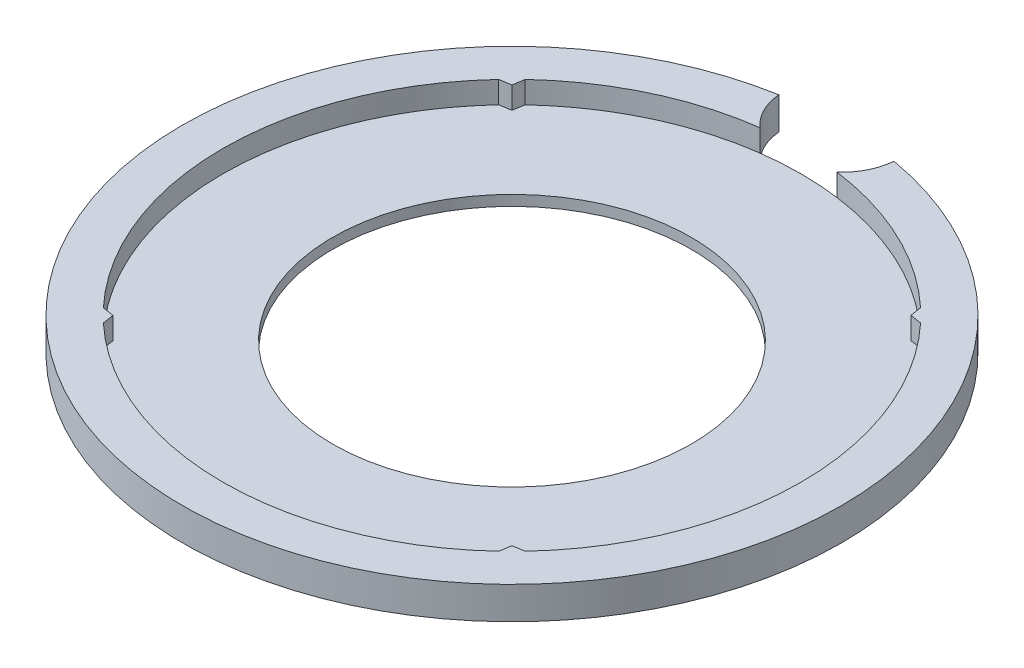
ISO-10303-21;
HEADER;
FILE_DESCRIPTION(('STEP AP214'),'2;1');
FILE_NAME('part.step','',(''),(''),'','','');
FILE_SCHEMA(('AUTOMOTIVE_DESIGN { 1 0 10303 214 1 1 1 1 }'));
ENDSEC;
DATA;
#1=APPLICATION_CONTEXT('core data for automotive mechanical design processes');
#2=APPLICATION_PROTOCOL_DEFINITION('international standard','automotive_design',2000,#1);
#3=PRODUCT_CONTEXT('',#1,'mechanical');
#4=PRODUCT('Part','Part','',(#3));
#5=PRODUCT_RELATED_PRODUCT_CATEGORY('part','',(#4));
#6=PRODUCT_DEFINITION_FORMATION('','',#4);
#7=PRODUCT_DEFINITION_CONTEXT('part definition',#1,'design');
#8=PRODUCT_DEFINITION('design','',#6,#7);
#9=PRODUCT_DEFINITION_SHAPE('','',#8);
#10=(LENGTH_UNIT() NAMED_UNIT(*) SI_UNIT(.MILLI.,.METRE.));
#11=(NAMED_UNIT(*) PLANE_ANGLE_UNIT() SI_UNIT($,.RADIAN.));
#12=(NAMED_UNIT(*) SI_UNIT($,.STERADIAN.) SOLID_ANGLE_UNIT());
#13=UNCERTAINTY_MEASURE_WITH_UNIT(LENGTH_MEASURE(1.E-05),#10,'distance_accuracy_value','');
#14=(GEOMETRIC_REPRESENTATION_CONTEXT(3) GLOBAL_UNCERTAINTY_ASSIGNED_CONTEXT((#13)) GLOBAL_UNIT_ASSIGNED_CONTEXT((#10,
#11,#12)) REPRESENTATION_CONTEXT('',''));
#15=CARTESIAN_POINT('',(0.,0.,0.));
#16=DIRECTION('',(0.,0.,1.));
#17=DIRECTION('',(1.,0.,0.));
#18=AXIS2_PLACEMENT_3D('',#15,#16,#17);
#19=CARTESIAN_POINT('',(0.,2.8,0.));
#20=DIRECTION('',(0.,-1.,0.));
#21=DIRECTION('',(0.,0.,-1.));
#22=AXIS2_PLACEMENT_3D('',#19,#20,#21);
#23=CYLINDRICAL_SURFACE('',#22,25.);
#24=DIRECTION('',(0.,1.,0.));
#25=VECTOR('',#24,1.);
#26=CARTESIAN_POINT('',(-18.2409192326324,-1.61934024607922,-17.0958727635818));
#27=LINE('',#26,#25);
#28=CARTESIAN_POINT('',(-18.2409192326324,0.,-17.0958727635818));
#29=VERTEX_POINT('',#28);
#30=CARTESIAN_POINT('',(-18.2409192326324,2.8,-17.0958727635818));
#31=VERTEX_POINT('',#30);
#32=EDGE_CURVE('E176',#29,#31,#27,.T.);
#33=ORIENTED_EDGE('',*,*,#32,.T.);
#34=CARTESIAN_POINT('',(0.,2.8,0.));
#35=DIRECTION('',(0.,-1.,0.));
#36=DIRECTION('',(0.,0.,-1.));
#37=AXIS2_PLACEMENT_3D('',#34,#35,#36);
#38=CIRCLE('',#37,25.);
#39=CARTESIAN_POINT('',(-18.2409192326327,2.8,17.0958727635816));
#40=VERTEX_POINT('',#39);
#41=EDGE_CURVE('E281',#40,#31,#38,.T.);
#42=ORIENTED_EDGE('',*,*,#41,.F.);
#43=DIRECTION('',(0.,1.,0.));
#44=VECTOR('',#43,1.);
#45=CARTESIAN_POINT('',(-18.2409192326327,-1.61934024607922,17.0958727635816));
#46=LINE('',#45,#44);
#47=CARTESIAN_POINT('',(-18.2409192326327,0.,17.0958727635816));
#48=VERTEX_POINT('',#47);
#49=EDGE_CURVE('E69',#48,#40,#46,.T.);
#50=ORIENTED_EDGE('',*,*,#49,.F.);
#51=CARTESIAN_POINT('',(0.,0.,0.));
#52=DIRECTION('',(0.,-1.,0.));
#53=DIRECTION('',(0.,0.,-1.));
#54=AXIS2_PLACEMENT_3D('',#51,#52,#53);
#55=CIRCLE('',#54,25.);
#56=EDGE_CURVE('E305',#48,#29,#55,.T.);
#57=ORIENTED_EDGE('',*,*,#56,.T.);
#58=EDGE_LOOP('',(#33,#42,#50,#57));
#59=FACE_BOUND('',#58,.T.);
#60=ADVANCED_FACE('F46',(#59),#23,.F.);
#61=DIRECTION('',(0.,1.,0.));
#62=VECTOR('',#61,1.);
#63=CARTESIAN_POINT('',(-17.0958727635818,-1.61934024607922,18.2409192326325));
#64=LINE('',#63,#62);
#65=CARTESIAN_POINT('',(-17.0958727635818,0.,18.2409192326325));
#66=VERTEX_POINT('',#65);
#67=CARTESIAN_POINT('',(-17.0958727635818,2.8,18.2409192326325));
#68=VERTEX_POINT('',#67);
#69=EDGE_CURVE('E190',#66,#68,#64,.T.);
#70=ORIENTED_EDGE('',*,*,#69,.T.);
#71=CARTESIAN_POINT('',(17.0958727635817,2.8,18.2409192326326));
#72=VERTEX_POINT('',#71);
#73=EDGE_CURVE('E283',#72,#68,#38,.T.);
#74=ORIENTED_EDGE('',*,*,#73,.F.);
#75=DIRECTION('',(0.,1.,0.));
#76=VECTOR('',#75,1.);
#77=CARTESIAN_POINT('',(17.0958727635817,-1.61934024607922,18.2409192326326));
#78=LINE('',#77,#76);
#79=CARTESIAN_POINT('',(17.0958727635817,0.,18.2409192326326));
#80=VERTEX_POINT('',#79);
#81=EDGE_CURVE('E206',#80,#72,#78,.T.);
#82=ORIENTED_EDGE('',*,*,#81,.F.);
#83=EDGE_CURVE('E302',#80,#66,#55,.T.);
#84=ORIENTED_EDGE('',*,*,#83,.T.);
#85=EDGE_LOOP('',(#70,#74,#82,#84));
#86=FACE_BOUND('',#85,.T.);
#87=ADVANCED_FACE('F301',(#86),#23,.F.);
#88=DIRECTION('',(0.,1.,0.));
#89=VECTOR('',#88,1.);
#90=CARTESIAN_POINT('',(18.2409192326326,-1.61934024607922,17.0958727635817));
#91=LINE('',#90,#89);
#92=CARTESIAN_POINT('',(18.2409192326326,0.,17.0958727635817));
#93=VERTEX_POINT('',#92);
#94=CARTESIAN_POINT('',(18.2409192326326,2.8,17.0958727635817));
#95=VERTEX_POINT('',#94);
#96=EDGE_CURVE('E205',#93,#95,#91,.T.);
#97=ORIENTED_EDGE('',*,*,#96,.T.);
#98=CARTESIAN_POINT('',(18.2409192326328,2.8,-17.0958727635815));
#99=VERTEX_POINT('',#98);
#100=EDGE_CURVE('E255',#99,#95,#38,.T.);
#101=ORIENTED_EDGE('',*,*,#100,.F.);
#102=DIRECTION('',(0.,1.,0.));
#103=VECTOR('',#102,1.);
#104=CARTESIAN_POINT('',(18.2409192326328,-1.61934024607922,-17.0958727635815));
#105=LINE('',#104,#103);
#106=CARTESIAN_POINT('',(18.2409192326328,0.,-17.0958727635815));
#107=VERTEX_POINT('',#106);
#108=EDGE_CURVE('E233',#107,#99,#105,.T.);
#109=ORIENTED_EDGE('',*,*,#108,.F.);
#110=EDGE_CURVE('E259',#107,#93,#55,.T.);
#111=ORIENTED_EDGE('',*,*,#110,.T.);
#112=EDGE_LOOP('',(#97,#101,#109,#111));
#113=FACE_BOUND('',#112,.T.);
#114=ADVANCED_FACE('F326',(#113),#23,.F.);
#115=DIRECTION('',(0.,1.,0.));
#116=VECTOR('',#115,1.);
#117=CARTESIAN_POINT('',(17.0958727635819,-1.61934024607922,-18.2409192326324));
#118=LINE('',#117,#116);
#119=CARTESIAN_POINT('',(17.0958727635819,0.,-18.2409192326324));
#120=VERTEX_POINT('',#119);
#121=CARTESIAN_POINT('',(17.0958727635819,2.8,-18.2409192326324));
#122=VERTEX_POINT('',#121);
#123=EDGE_CURVE('E236',#120,#122,#118,.T.);
#124=ORIENTED_EDGE('',*,*,#123,.T.);
#125=CARTESIAN_POINT('',(3.33679125812165,2.8,-24.7763157894737));
#126=VERTEX_POINT('',#125);
#127=EDGE_CURVE('E251',#126,#122,#38,.T.);
#128=ORIENTED_EDGE('',*,*,#127,.F.);
#129=DIRECTION('',(0.,1.,0.));
#130=VECTOR('',#129,1.);
#131=CARTESIAN_POINT('',(3.33679125812165,1.400006,-24.7763157894737));
#132=LINE('',#131,#130);
#133=CARTESIAN_POINT('',(3.33679125812164,0.,-24.7763157894737));
#134=VERTEX_POINT('',#133);
#135=EDGE_CURVE('E12',#126,#134,#132,.F.);
#136=ORIENTED_EDGE('',*,*,#135,.T.);
#137=EDGE_CURVE('E257',#134,#120,#55,.T.);
#138=ORIENTED_EDGE('',*,*,#137,.T.);
#139=EDGE_LOOP('',(#124,#128,#136,#138));
#140=FACE_BOUND('',#139,.T.);
#141=ADVANCED_FACE('F330',(#140),#23,.F.);
#142=CARTESIAN_POINT('',(0.,2.8,0.));
#143=DIRECTION('',(0.,-1.,0.));
#144=DIRECTION('',(0.,0.,-1.));
#145=AXIS2_PLACEMENT_3D('',#142,#143,#144);
#146=CYLINDRICAL_SURFACE('',#145,28.5);
#147=DIRECTION('',(0.,1.,0.));
#148=VECTOR('',#147,1.);
#149=CARTESIAN_POINT('',(4.98072616371172,1.400006,-28.0614035087719));
#150=LINE('',#149,#148);
#151=CARTESIAN_POINT('',(4.9807261637117,2.8,-28.0614035087719));
#152=VERTEX_POINT('',#151);
#153=CARTESIAN_POINT('',(4.98072616371172,0.,-28.0614035087719));
#154=VERTEX_POINT('',#153);
#155=EDGE_CURVE('E249',#152,#154,#150,.F.);
#156=ORIENTED_EDGE('',*,*,#155,.F.);
#157=CARTESIAN_POINT('',(0.,2.8,0.));
#158=DIRECTION('',(0.,-1.,0.));
#159=DIRECTION('',(0.,0.,-1.));
#160=AXIS2_PLACEMENT_3D('',#157,#158,#159);
#161=CIRCLE('',#160,28.5);
#162=CARTESIAN_POINT('',(-4.9807261637117,2.8,-28.0614035087719));
#163=VERTEX_POINT('',#162);
#164=EDGE_CURVE('E260',#152,#163,#161,.T.);
#165=ORIENTED_EDGE('',*,*,#164,.T.);
#166=DIRECTION('',(0.,1.,0.));
#167=VECTOR('',#166,1.);
#168=CARTESIAN_POINT('',(-4.98072616371172,1.400006,-28.0614035087719));
#169=LINE('',#168,#167);
#170=CARTESIAN_POINT('',(-4.98072616371172,0.,-28.0614035087719));
#171=VERTEX_POINT('',#170);
#172=EDGE_CURVE('E246',#171,#163,#169,.T.);
#173=ORIENTED_EDGE('',*,*,#172,.F.);
#174=CARTESIAN_POINT('',(0.,0.,0.));
#175=DIRECTION('',(0.,-1.,0.));
#176=DIRECTION('',(0.,0.,-1.));
#177=AXIS2_PLACEMENT_3D('',#174,#175,#176);
#178=CIRCLE('',#177,28.5);
#179=EDGE_CURVE('E254',#154,#171,#178,.T.);
#180=ORIENTED_EDGE('',*,*,#179,.F.);
#181=EDGE_LOOP('',(#156,#165,#173,#180));
#182=FACE_BOUND('',#181,.T.);
#183=ADVANCED_FACE('F48',(#182),#146,.T.);
#184=CARTESIAN_POINT('',(0.,2.8,0.));
#185=DIRECTION('',(0.,-1.,0.));
#186=DIRECTION('',(0.,0.,-1.));
#187=AXIS2_PLACEMENT_3D('',#184,#185,#186);
#188=PLANE('',#187);
#189=ORIENTED_EDGE('',*,*,#164,.F.);
#190=CARTESIAN_POINT('',(0.,2.8,-28.5));
#191=DIRECTION('',(0.,-1.,0.));
#192=DIRECTION('',(0.,0.,-1.));
#193=AXIS2_PLACEMENT_3D('',#190,#191,#192);
#194=CIRCLE('',#193,5.);
#195=EDGE_CURVE('E247',#152,#126,#194,.T.);
#196=ORIENTED_EDGE('',*,*,#195,.T.);
#197=ORIENTED_EDGE('',*,*,#127,.T.);
#198=DIRECTION('',(-0.157532697370056,0.,-0.987513771680838));
#199=VECTOR('',#198,1.);
#200=CARTESIAN_POINT('',(19.5092736872912,2.8,-3.11220825048193));
#201=LINE('',#200,#199);
#202=CARTESIAN_POINT('',(17.253405460952,2.8,-17.2534054609516));
#203=VERTEX_POINT('',#202);
#204=EDGE_CURVE('E226',#203,#122,#201,.T.);
#205=ORIENTED_EDGE('',*,*,#204,.F.);
#206=DIRECTION('',(0.987513771680834,0.,0.15753269737008));
#207=VECTOR('',#206,1.);
#208=CARTESIAN_POINT('',(3.11220825048241,2.8,-19.5092736872911));
#209=LINE('',#208,#207);
#210=EDGE_CURVE('E222',#203,#99,#209,.T.);
#211=ORIENTED_EDGE('',*,*,#210,.T.);
#212=ORIENTED_EDGE('',*,*,#100,.T.);
#213=DIRECTION('',(0.987513771680837,0.,-0.157532697370066));
#214=VECTOR('',#213,1.);
#215=CARTESIAN_POINT('',(3.11220825048213,2.8,19.5092736872911));
#216=LINE('',#215,#214);
#217=CARTESIAN_POINT('',(17.2534054609517,2.8,17.2534054609518));
#218=VERTEX_POINT('',#217);
#219=EDGE_CURVE('E197',#218,#95,#216,.T.);
#220=ORIENTED_EDGE('',*,*,#219,.F.);
#221=DIRECTION('',(-0.157532697370066,0.,0.987513771680837));
#222=VECTOR('',#221,1.);
#223=CARTESIAN_POINT('',(19.5092736872911,2.8,3.11220825048212));
#224=LINE('',#223,#222);
#225=EDGE_CURVE('E215',#218,#72,#224,.T.);
#226=ORIENTED_EDGE('',*,*,#225,.T.);
#227=ORIENTED_EDGE('',*,*,#73,.T.);
#228=DIRECTION('',(0.157532697370062,0.,0.987513771680837));
#229=VECTOR('',#228,1.);
#230=CARTESIAN_POINT('',(-19.5092736872911,2.8,3.11220825048206));
#231=LINE('',#230,#229);
#232=CARTESIAN_POINT('',(-17.2534054609519,2.8,17.2534054609517));
#233=VERTEX_POINT('',#232);
#234=EDGE_CURVE('E180',#233,#68,#231,.T.);
#235=ORIENTED_EDGE('',*,*,#234,.F.);
#236=DIRECTION('',(-0.987513771680835,0.,-0.157532697370073));
#237=VECTOR('',#236,1.);
#238=CARTESIAN_POINT('',(-3.11220825048227,2.8,19.5092736872911));
#239=LINE('',#238,#237);
#240=EDGE_CURVE('E198',#233,#40,#239,.T.);
#241=ORIENTED_EDGE('',*,*,#240,.T.);
#242=ORIENTED_EDGE('',*,*,#41,.T.);
#243=DIRECTION('',(-0.987513771680837,0.,0.157532697370062));
#244=VECTOR('',#243,1.);
#245=CARTESIAN_POINT('',(-17.2534054609516,2.8,-17.2534054609519));
#246=LINE('',#245,#244);
#247=CARTESIAN_POINT('',(-17.2534054609516,2.8,-17.2534054609519));
#248=VERTEX_POINT('',#247);
#249=EDGE_CURVE('E166',#248,#31,#246,.T.);
#250=ORIENTED_EDGE('',*,*,#249,.F.);
#251=DIRECTION('',(0.157532697370073,0.,-0.987513771680835));
#252=VECTOR('',#251,1.);
#253=CARTESIAN_POINT('',(-17.2534054609516,2.8,-17.2534054609519));
#254=LINE('',#253,#252);
#255=CARTESIAN_POINT('',(-17.0958727635815,2.8,-18.2409192326328));
#256=VERTEX_POINT('',#255);
#257=EDGE_CURVE('E173',#248,#256,#254,.T.);
#258=ORIENTED_EDGE('',*,*,#257,.T.);
#259=CARTESIAN_POINT('',(-3.33679125812166,2.8,-24.7763157894737));
#260=VERTEX_POINT('',#259);
#261=EDGE_CURVE('E256',#256,#260,#38,.T.);
#262=ORIENTED_EDGE('',*,*,#261,.T.);
#263=EDGE_CURVE('E243',#260,#163,#194,.T.);
#264=ORIENTED_EDGE('',*,*,#263,.T.);
#265=EDGE_LOOP('',(#189,#196,#197,#205,#211,#212,#220,#226,#227,#235,#241,#242,#250,#258,#262,#264));
#266=FACE_BOUND('',#265,.T.);
#267=ADVANCED_FACE('F279',(#266),#188,.F.);
#268=CARTESIAN_POINT('',(0.,0.,0.));
#269=DIRECTION('',(0.,-1.,0.));
#270=DIRECTION('',(0.,0.,-1.));
#271=AXIS2_PLACEMENT_3D('',#268,#269,#270);
#272=PLANE('',#271);
#273=CARTESIAN_POINT('',(0.,0.,-28.5));
#274=DIRECTION('',(0.,1.,0.));
#275=DIRECTION('',(0.,0.,1.));
#276=AXIS2_PLACEMENT_3D('',#273,#274,#275);
#277=CIRCLE('',#276,5.);
#278=EDGE_CURVE('E241',#134,#154,#277,.T.);
#279=ORIENTED_EDGE('',*,*,#278,.T.);
#280=ORIENTED_EDGE('',*,*,#179,.T.);
#281=CARTESIAN_POINT('',(-3.33679125812164,0.,-24.7763157894737));
#282=VERTEX_POINT('',#281);
#283=EDGE_CURVE('E229',#171,#282,#277,.T.);
#284=ORIENTED_EDGE('',*,*,#283,.T.);
#285=CARTESIAN_POINT('',(-17.0958727635815,0.,-18.2409192326327));
#286=VERTEX_POINT('',#285);
#287=EDGE_CURVE('E165',#286,#282,#55,.T.);
#288=ORIENTED_EDGE('',*,*,#287,.F.);
#289=DIRECTION('',(0.157532697370073,0.,-0.987513771680835));
#290=VECTOR('',#289,1.);
#291=CARTESIAN_POINT('',(-17.2534054609516,0.,-17.2534054609519));
#292=LINE('',#291,#290);
#293=CARTESIAN_POINT('',(-17.2534054609516,0.,-17.2534054609519));
#294=VERTEX_POINT('',#293);
#295=EDGE_CURVE('E61',#294,#286,#292,.T.);
#296=ORIENTED_EDGE('',*,*,#295,.F.);
#297=DIRECTION('',(-0.987513771680837,0.,0.157532697370063));
#298=VECTOR('',#297,1.);
#299=CARTESIAN_POINT('',(-17.2534054609516,0.,-17.2534054609519));
#300=LINE('',#299,#298);
#301=EDGE_CURVE('E162',#294,#29,#300,.T.);
#302=ORIENTED_EDGE('',*,*,#301,.T.);
#303=ORIENTED_EDGE('',*,*,#56,.F.);
#304=DIRECTION('',(-0.987513771680835,0.,-0.157532697370073));
#305=VECTOR('',#304,1.);
#306=CARTESIAN_POINT('',(-3.11220825048227,0.,19.5092736872911));
#307=LINE('',#306,#305);
#308=CARTESIAN_POINT('',(-17.2534054609519,0.,17.2534054609517));
#309=VERTEX_POINT('',#308);
#310=EDGE_CURVE('E192',#309,#48,#307,.T.);
#311=ORIENTED_EDGE('',*,*,#310,.F.);
#312=DIRECTION('',(0.157532697370063,0.,0.987513771680837));
#313=VECTOR('',#312,1.);
#314=CARTESIAN_POINT('',(-19.5092736872911,0.,3.11220825048206));
#315=LINE('',#314,#313);
#316=EDGE_CURVE('E194',#309,#66,#315,.T.);
#317=ORIENTED_EDGE('',*,*,#316,.T.);
#318=ORIENTED_EDGE('',*,*,#83,.F.);
#319=DIRECTION('',(-0.157532697370066,0.,0.987513771680837));
#320=VECTOR('',#319,1.);
#321=CARTESIAN_POINT('',(19.5092736872911,0.,3.11220825048212));
#322=LINE('',#321,#320);
#323=CARTESIAN_POINT('',(17.2534054609517,0.,17.2534054609518));
#324=VERTEX_POINT('',#323);
#325=EDGE_CURVE('E209',#324,#80,#322,.T.);
#326=ORIENTED_EDGE('',*,*,#325,.F.);
#327=DIRECTION('',(0.987513771680837,0.,-0.157532697370066));
#328=VECTOR('',#327,1.);
#329=CARTESIAN_POINT('',(3.11220825048213,0.,19.5092736872911));
#330=LINE('',#329,#328);
#331=EDGE_CURVE('E211',#324,#93,#330,.T.);
#332=ORIENTED_EDGE('',*,*,#331,.T.);
#333=ORIENTED_EDGE('',*,*,#110,.F.);
#334=DIRECTION('',(0.987513771680834,0.,0.15753269737008));
#335=VECTOR('',#334,1.);
#336=CARTESIAN_POINT('',(3.11220825048241,0.,-19.5092736872911));
#337=LINE('',#336,#335);
#338=CARTESIAN_POINT('',(17.253405460952,0.,-17.2534054609516));
#339=VERTEX_POINT('',#338);
#340=EDGE_CURVE('E225',#339,#107,#337,.T.);
#341=ORIENTED_EDGE('',*,*,#340,.F.);
#342=DIRECTION('',(-0.157532697370056,0.,-0.987513771680838));
#343=VECTOR('',#342,1.);
#344=CARTESIAN_POINT('',(19.5092736872912,0.,-3.11220825048193));
#345=LINE('',#344,#343);
#346=EDGE_CURVE('E214',#339,#120,#345,.T.);
#347=ORIENTED_EDGE('',*,*,#346,.T.);
#348=ORIENTED_EDGE('',*,*,#137,.F.);
#349=EDGE_LOOP('',(#279,#280,#284,#288,#296,#302,#303,#311,#317,#318,#326,#332,#333,#341,#347,#348));
#350=FACE_BOUND('',#349,.T.);
#351=ADVANCED_FACE('F160',(#350),#272,.T.);
#352=ORIENTED_EDGE('',*,*,#261,.F.);
#353=DIRECTION('',(0.,1.,0.));
#354=VECTOR('',#353,1.);
#355=CARTESIAN_POINT('',(-17.0958727635815,-1.61934024607922,-18.2409192326328));
#356=LINE('',#355,#354);
#357=EDGE_CURVE('E167',#286,#256,#356,.T.);
#358=ORIENTED_EDGE('',*,*,#357,.F.);
#359=ORIENTED_EDGE('',*,*,#287,.T.);
#360=DIRECTION('',(0.,1.,0.));
#361=VECTOR('',#360,1.);
#362=CARTESIAN_POINT('',(-3.33679125812165,1.400006,-24.7763157894737));
#363=LINE('',#362,#361);
#364=EDGE_CURVE('E54',#282,#260,#363,.T.);
#365=ORIENTED_EDGE('',*,*,#364,.T.);
#366=EDGE_LOOP('',(#352,#358,#359,#365));
#367=FACE_BOUND('',#366,.T.);
#368=ADVANCED_FACE('F268',(#367),#23,.F.);
#369=CARTESIAN_POINT('',(0.,0.,-28.5));
#370=DIRECTION('',(0.,1.,0.));
#371=DIRECTION('',(0.,0.,1.));
#372=AXIS2_PLACEMENT_3D('',#369,#370,#371);
#373=CYLINDRICAL_SURFACE('',#372,5.);
#374=ORIENTED_EDGE('',*,*,#172,.T.);
#375=ORIENTED_EDGE('',*,*,#263,.F.);
#376=ORIENTED_EDGE('',*,*,#364,.F.);
#377=ORIENTED_EDGE('',*,*,#283,.F.);
#378=EDGE_LOOP('',(#374,#375,#376,#377));
#379=FACE_BOUND('',#378,.T.);
#380=ADVANCED_FACE('F271',(#379),#373,.F.);
#381=ORIENTED_EDGE('',*,*,#155,.T.);
#382=ORIENTED_EDGE('',*,*,#278,.F.);
#383=ORIENTED_EDGE('',*,*,#135,.F.);
#384=ORIENTED_EDGE('',*,*,#195,.F.);
#385=EDGE_LOOP('',(#381,#382,#383,#384));
#386=FACE_BOUND('',#385,.T.);
#387=ADVANCED_FACE('F335',(#386),#373,.F.);
#388=CARTESIAN_POINT('',(3.11220825048241,-1.61934024607922,-19.5092736872911));
#389=DIRECTION('',(-0.15753269737008,0.,0.987513771680834));
#390=DIRECTION('',(0.987513771680834,0.,0.15753269737008));
#391=AXIS2_PLACEMENT_3D('',#388,#389,#390);
#392=PLANE('',#391);
#393=DIRECTION('',(0.,1.,0.));
#394=VECTOR('',#393,1.);
#395=CARTESIAN_POINT('',(17.253405460952,-1.61934024607922,-17.2534054609516));
#396=LINE('',#395,#394);
#397=EDGE_CURVE('E230',#339,#203,#396,.T.);
#398=ORIENTED_EDGE('',*,*,#397,.F.);
#399=ORIENTED_EDGE('',*,*,#340,.T.);
#400=ORIENTED_EDGE('',*,*,#108,.T.);
#401=ORIENTED_EDGE('',*,*,#210,.F.);
#402=EDGE_LOOP('',(#398,#399,#400,#401));
#403=FACE_BOUND('',#402,.T.);
#404=ADVANCED_FACE('F349',(#403),#392,.T.);
#405=CARTESIAN_POINT('',(19.5092736872912,-1.61934024607922,-3.11220825048193));
#406=DIRECTION('',(0.987513771680838,0.,-0.157532697370056));
#407=DIRECTION('',(-0.157532697370056,0.,-0.987513771680838));
#408=AXIS2_PLACEMENT_3D('',#405,#406,#407);
#409=PLANE('',#408);
#410=ORIENTED_EDGE('',*,*,#346,.F.);
#411=ORIENTED_EDGE('',*,*,#397,.T.);
#412=ORIENTED_EDGE('',*,*,#204,.T.);
#413=ORIENTED_EDGE('',*,*,#123,.F.);
#414=EDGE_LOOP('',(#410,#411,#412,#413));
#415=FACE_BOUND('',#414,.T.);
#416=ADVANCED_FACE('F346',(#415),#409,.F.);
#417=CARTESIAN_POINT('',(19.5092736872911,-1.61934024607922,3.11220825048212));
#418=DIRECTION('',(-0.987513771680836,0.,-0.157532697370066));
#419=DIRECTION('',(-0.157532697370066,0.,0.987513771680837));
#420=AXIS2_PLACEMENT_3D('',#417,#418,#419);
#421=PLANE('',#420);
#422=DIRECTION('',(0.,1.,0.));
#423=VECTOR('',#422,1.);
#424=CARTESIAN_POINT('',(17.2534054609517,-1.61934024607922,17.2534054609518));
#425=LINE('',#424,#423);
#426=EDGE_CURVE('E203',#324,#218,#425,.T.);
#427=ORIENTED_EDGE('',*,*,#426,.F.);
#428=ORIENTED_EDGE('',*,*,#325,.T.);
#429=ORIENTED_EDGE('',*,*,#81,.T.);
#430=ORIENTED_EDGE('',*,*,#225,.F.);
#431=EDGE_LOOP('',(#427,#428,#429,#430));
#432=FACE_BOUND('',#431,.T.);
#433=ADVANCED_FACE('F298',(#432),#421,.T.);
#434=CARTESIAN_POINT('',(3.11220825048213,-1.61934024607922,19.5092736872911));
#435=DIRECTION('',(0.157532697370066,0.,0.987513771680836));
#436=DIRECTION('',(0.987513771680837,0.,-0.157532697370066));
#437=AXIS2_PLACEMENT_3D('',#434,#435,#436);
#438=PLANE('',#437);
#439=ORIENTED_EDGE('',*,*,#331,.F.);
#440=ORIENTED_EDGE('',*,*,#426,.T.);
#441=ORIENTED_EDGE('',*,*,#219,.T.);
#442=ORIENTED_EDGE('',*,*,#96,.F.);
#443=EDGE_LOOP('',(#439,#440,#441,#442));
#444=FACE_BOUND('',#443,.T.);
#445=ADVANCED_FACE('F295',(#444),#438,.F.);
#446=CARTESIAN_POINT('',(-3.11220825048227,-1.61934024607922,19.5092736872911));
#447=DIRECTION('',(0.157532697370073,0.,-0.987513771680835));
#448=DIRECTION('',(-0.987513771680835,0.,-0.157532697370073));
#449=AXIS2_PLACEMENT_3D('',#446,#447,#448);
#450=PLANE('',#449);
#451=DIRECTION('',(0.,1.,0.));
#452=VECTOR('',#451,1.);
#453=CARTESIAN_POINT('',(-17.2534054609519,-1.61934024607922,17.2534054609517));
#454=LINE('',#453,#452);
#455=EDGE_CURVE('E183',#309,#233,#454,.T.);
#456=ORIENTED_EDGE('',*,*,#455,.F.);
#457=ORIENTED_EDGE('',*,*,#310,.T.);
#458=ORIENTED_EDGE('',*,*,#49,.T.);
#459=ORIENTED_EDGE('',*,*,#240,.F.);
#460=EDGE_LOOP('',(#456,#457,#458,#459));
#461=FACE_BOUND('',#460,.T.);
#462=ADVANCED_FACE('F308',(#461),#450,.T.);
#463=CARTESIAN_POINT('',(-19.5092736872911,-1.61934024607922,3.11220825048206));
#464=DIRECTION('',(-0.987513771680837,0.,0.157532697370062));
#465=DIRECTION('',(0.157532697370063,0.,0.987513771680837));
#466=AXIS2_PLACEMENT_3D('',#463,#464,#465);
#467=PLANE('',#466);
#468=ORIENTED_EDGE('',*,*,#316,.F.);
#469=ORIENTED_EDGE('',*,*,#455,.T.);
#470=ORIENTED_EDGE('',*,*,#234,.T.);
#471=ORIENTED_EDGE('',*,*,#69,.F.);
#472=EDGE_LOOP('',(#468,#469,#470,#471));
#473=FACE_BOUND('',#472,.T.);
#474=ADVANCED_FACE('F311',(#473),#467,.F.);
#475=CARTESIAN_POINT('',(-17.2534054609516,-1.61934024607922,-17.2534054609519));
#476=DIRECTION('',(-0.157532697370062,0.,-0.987513771680837));
#477=DIRECTION('',(-0.987513771680837,0.,0.157532697370063));
#478=AXIS2_PLACEMENT_3D('',#475,#476,#477);
#479=PLANE('',#478);
#480=ORIENTED_EDGE('',*,*,#301,.F.);
#481=DIRECTION('',(0.,1.,0.));
#482=VECTOR('',#481,1.);
#483=CARTESIAN_POINT('',(-17.2534054609516,-1.61934024607922,-17.2534054609519));
#484=LINE('',#483,#482);
#485=EDGE_CURVE('E170',#294,#248,#484,.T.);
#486=ORIENTED_EDGE('',*,*,#485,.T.);
#487=ORIENTED_EDGE('',*,*,#249,.T.);
#488=ORIENTED_EDGE('',*,*,#32,.F.);
#489=EDGE_LOOP('',(#480,#486,#487,#488));
#490=FACE_BOUND('',#489,.T.);
#491=ADVANCED_FACE('F178',(#490),#479,.F.);
#492=CARTESIAN_POINT('',(-17.2534054609516,-1.61934024607922,-17.2534054609519));
#493=DIRECTION('',(0.987513771680835,0.,0.157532697370073));
#494=DIRECTION('',(0.157532697370073,0.,-0.987513771680835));
#495=AXIS2_PLACEMENT_3D('',#492,#493,#494);
#496=PLANE('',#495);
#497=ORIENTED_EDGE('',*,*,#485,.F.);
#498=ORIENTED_EDGE('',*,*,#295,.T.);
#499=ORIENTED_EDGE('',*,*,#357,.T.);
#500=ORIENTED_EDGE('',*,*,#257,.F.);
#501=EDGE_LOOP('',(#497,#498,#499,#500));
#502=FACE_BOUND('',#501,.T.);
#503=ADVANCED_FACE('F171',(#502),#496,.T.);
#504=CLOSED_SHELL('',(#60,#87,#114,#141,#183,#267,#351,#368,#380,#387,#404,#416,#433,#445,#462,
#474,#491,#503));
#505=MANIFOLD_SOLID_BREP('B2',#504);
#506=CARTESIAN_POINT('',(0.,0.9,0.));
#507=DIRECTION('',(0.,1.,0.));
#508=DIRECTION('',(0.,0.,1.));
#509=AXIS2_PLACEMENT_3D('',#506,#507,#508);
#510=PLANE('',#509);
#511=CARTESIAN_POINT('',(0.,0.9,0.));
#512=DIRECTION('',(0.,1.,0.));
#513=DIRECTION('',(0.,0.,1.));
#514=AXIS2_PLACEMENT_3D('',#511,#512,#513);
#515=CIRCLE('',#514,25.);
#516=CARTESIAN_POINT('',(0.,0.9,25.));
#517=VERTEX_POINT('',#516);
#518=EDGE_CURVE('E45',#517,#517,#515,.T.);
#519=ORIENTED_EDGE('',*,*,#518,.T.);
#520=EDGE_LOOP('',(#519));
#521=FACE_BOUND('',#520,.T.);
#522=CARTESIAN_POINT('',(0.,0.9,0.));
#523=DIRECTION('',(0.,1.,0.));
#524=DIRECTION('',(0.,0.,1.));
#525=AXIS2_PLACEMENT_3D('',#522,#523,#524);
#526=CIRCLE('',#525,15.5);
#527=CARTESIAN_POINT('',(0.,0.9,15.5));
#528=VERTEX_POINT('',#527);
#529=EDGE_CURVE('E501',#528,#528,#526,.T.);
#530=ORIENTED_EDGE('',*,*,#529,.F.);
#531=EDGE_LOOP('',(#530));
#532=FACE_BOUND('',#531,.T.);
#533=ADVANCED_FACE('F490',(#521,#532),#510,.T.);
#534=CARTESIAN_POINT('',(0.,0.,0.));
#535=DIRECTION('',(0.,1.,0.));
#536=DIRECTION('',(0.,0.,1.));
#537=AXIS2_PLACEMENT_3D('',#534,#535,#536);
#538=PLANE('',#537);
#539=CARTESIAN_POINT('',(0.,0.,0.));
#540=DIRECTION('',(0.,1.,0.));
#541=DIRECTION('',(0.,0.,1.));
#542=AXIS2_PLACEMENT_3D('',#539,#540,#541);
#543=CIRCLE('',#542,25.);
#544=CARTESIAN_POINT('',(0.,0.,25.));
#545=VERTEX_POINT('',#544);
#546=EDGE_CURVE('E494',#545,#545,#543,.T.);
#547=ORIENTED_EDGE('',*,*,#546,.F.);
#548=EDGE_LOOP('',(#547));
#549=FACE_BOUND('',#548,.T.);
#550=CARTESIAN_POINT('',(0.,0.,0.));
#551=DIRECTION('',(0.,1.,0.));
#552=DIRECTION('',(0.,0.,1.));
#553=AXIS2_PLACEMENT_3D('',#550,#551,#552);
#554=CIRCLE('',#553,15.5);
#555=CARTESIAN_POINT('',(0.,0.,15.5));
#556=VERTEX_POINT('',#555);
#557=EDGE_CURVE('E503',#556,#556,#554,.T.);
#558=ORIENTED_EDGE('',*,*,#557,.T.);
#559=EDGE_LOOP('',(#558));
#560=FACE_BOUND('',#559,.T.);
#561=ADVANCED_FACE('F513',(#549,#560),#538,.F.);
#562=CARTESIAN_POINT('',(0.,0.9,0.));
#563=DIRECTION('',(0.,-1.,0.));
#564=DIRECTION('',(0.,0.,-1.));
#565=AXIS2_PLACEMENT_3D('',#562,#563,#564);
#566=CYLINDRICAL_SURFACE('',#565,25.);
#567=ORIENTED_EDGE('',*,*,#518,.F.);
#568=EDGE_LOOP('',(#567));
#569=FACE_BOUND('',#568,.T.);
#570=ORIENTED_EDGE('',*,*,#546,.T.);
#571=EDGE_LOOP('',(#570));
#572=FACE_BOUND('',#571,.T.);
#573=ADVANCED_FACE('F492',(#569,#572),#566,.T.);
#574=CARTESIAN_POINT('',(0.,0.9,0.));
#575=DIRECTION('',(0.,-1.,0.));
#576=DIRECTION('',(0.,0.,-1.));
#577=AXIS2_PLACEMENT_3D('',#574,#575,#576);
#578=CYLINDRICAL_SURFACE('',#577,15.5);
#579=ORIENTED_EDGE('',*,*,#529,.T.);
#580=EDGE_LOOP('',(#579));
#581=FACE_BOUND('',#580,.T.);
#582=ORIENTED_EDGE('',*,*,#557,.F.);
#583=EDGE_LOOP('',(#582));
#584=FACE_BOUND('',#583,.T.);
#585=ADVANCED_FACE('F509',(#581,#584),#578,.F.);
#586=CLOSED_SHELL('',(#533,#561,#573,#585));
#587=MANIFOLD_SOLID_BREP('B6',#586);
#588=ADVANCED_BREP_SHAPE_REPRESENTATION('',(#18,#505,#587),#14);
#589=SHAPE_DEFINITION_REPRESENTATION(#9,#588);
ENDSEC;
END-ISO-10303-21;
